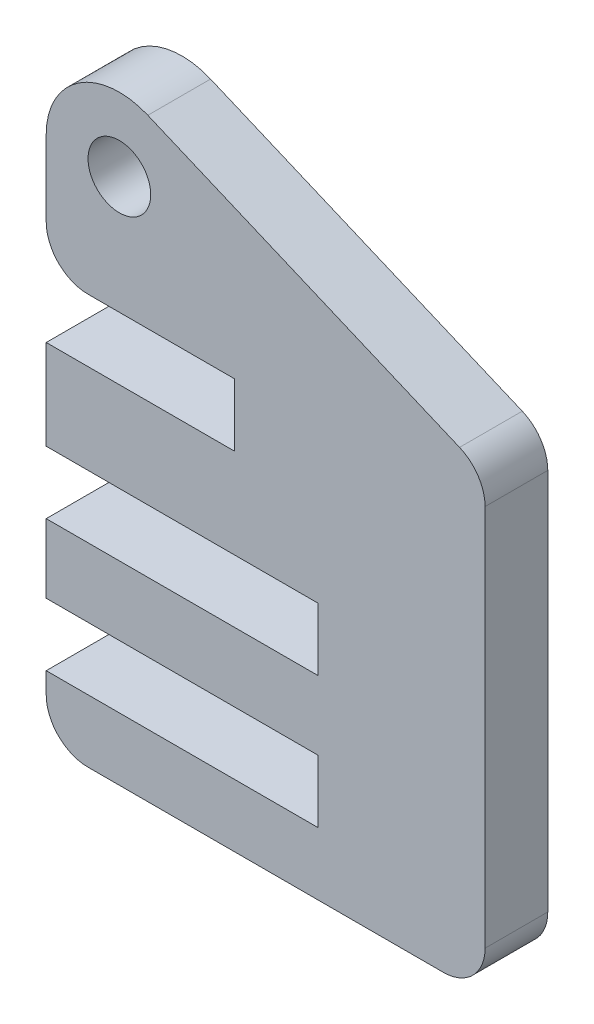
ISO-10303-21;
HEADER;
FILE_DESCRIPTION(('STEP AP214'),'2;1');
FILE_NAME('part.step','',(''),(''),'','','');
FILE_SCHEMA(('AUTOMOTIVE_DESIGN { 1 0 10303 214 1 1 1 1 }'));
ENDSEC;
DATA;
#1=APPLICATION_CONTEXT('core data for automotive mechanical design processes');
#2=APPLICATION_PROTOCOL_DEFINITION('international standard','automotive_design',2000,#1);
#3=PRODUCT_CONTEXT('',#1,'mechanical');
#4=PRODUCT('Part','Part','',(#3));
#5=PRODUCT_RELATED_PRODUCT_CATEGORY('part','',(#4));
#6=PRODUCT_DEFINITION_FORMATION('','',#4);
#7=PRODUCT_DEFINITION_CONTEXT('part definition',#1,'design');
#8=PRODUCT_DEFINITION('design','',#6,#7);
#9=PRODUCT_DEFINITION_SHAPE('','',#8);
#10=(LENGTH_UNIT() NAMED_UNIT(*) SI_UNIT(.MILLI.,.METRE.));
#11=(NAMED_UNIT(*) PLANE_ANGLE_UNIT() SI_UNIT($,.RADIAN.));
#12=(NAMED_UNIT(*) SI_UNIT($,.STERADIAN.) SOLID_ANGLE_UNIT());
#13=UNCERTAINTY_MEASURE_WITH_UNIT(LENGTH_MEASURE(1.E-05),#10,'distance_accuracy_value','');
#14=(GEOMETRIC_REPRESENTATION_CONTEXT(3) GLOBAL_UNCERTAINTY_ASSIGNED_CONTEXT((#13)) GLOBAL_UNIT_ASSIGNED_CONTEXT((#10,
#11,#12)) REPRESENTATION_CONTEXT('',''));
#15=CARTESIAN_POINT('',(0.,0.,0.));
#16=DIRECTION('',(0.,0.,1.));
#17=DIRECTION('',(1.,0.,0.));
#18=AXIS2_PLACEMENT_3D('',#15,#16,#17);
#19=CARTESIAN_POINT('',(-12.7493877892768,-1.50839993540983,3.));
#20=DIRECTION('',(1.,0.,0.));
#21=DIRECTION('',(0.,1.,0.));
#22=AXIS2_PLACEMENT_3D('',#19,#20,#21);
#23=PLANE('',#22);
#24=DIRECTION('',(0.,0.,1.));
#25=VECTOR('',#24,1.);
#26=CARTESIAN_POINT('',(-12.7493877892768,18.0916000645902,0.));
#27=LINE('',#26,#25);
#28=CARTESIAN_POINT('',(-12.7493877892768,18.0916000645902,0.));
#29=VERTEX_POINT('',#28);
#30=CARTESIAN_POINT('',(-12.7493877892768,18.0916000645902,3.));
#31=VERTEX_POINT('',#30);
#32=EDGE_CURVE('E242',#29,#31,#27,.T.);
#33=ORIENTED_EDGE('',*,*,#32,.T.);
#34=DIRECTION('',(0.,-1.,0.));
#35=VECTOR('',#34,1.);
#36=CARTESIAN_POINT('',(-12.7493877892768,-1.50839993540983,3.));
#37=LINE('',#36,#35);
#38=CARTESIAN_POINT('',(-12.7493877892768,21.7138330169719,3.));
#39=VERTEX_POINT('',#38);
#40=EDGE_CURVE('E330',#39,#31,#37,.T.);
#41=ORIENTED_EDGE('',*,*,#40,.F.);
#42=DIRECTION('',(0.,0.,-1.));
#43=VECTOR('',#42,1.);
#44=CARTESIAN_POINT('',(-12.7493877892768,21.7138330169719,3.));
#45=LINE('',#44,#43);
#46=CARTESIAN_POINT('',(-12.7493877892768,21.7138330169719,0.));
#47=VERTEX_POINT('',#46);
#48=EDGE_CURVE('E393',#39,#47,#45,.T.);
#49=ORIENTED_EDGE('',*,*,#48,.T.);
#50=DIRECTION('',(0.,-1.,0.));
#51=VECTOR('',#50,1.);
#52=CARTESIAN_POINT('',(-12.7493877892768,-1.50839993540983,0.));
#53=LINE('',#52,#51);
#54=EDGE_CURVE('E358',#47,#29,#53,.T.);
#55=ORIENTED_EDGE('',*,*,#54,.T.);
#56=EDGE_LOOP('',(#33,#41,#49,#55));
#57=FACE_BOUND('',#56,.T.);
#58=ADVANCED_FACE('F45',(#57),#23,.F.);
#59=CARTESIAN_POINT('',(-12.7493877892768,13.0916000645902,3.));
#60=VERTEX_POINT('',#59);
#61=CARTESIAN_POINT('',(-12.7493877892768,8.79160006459017,3.));
#62=VERTEX_POINT('',#61);
#63=EDGE_CURVE('E335',#60,#62,#37,.T.);
#64=ORIENTED_EDGE('',*,*,#63,.F.);
#65=DIRECTION('',(0.,0.,1.));
#66=VECTOR('',#65,1.);
#67=CARTESIAN_POINT('',(-12.7493877892768,13.0916000645902,0.));
#68=LINE('',#67,#66);
#69=CARTESIAN_POINT('',(-12.7493877892768,13.0916000645902,0.));
#70=VERTEX_POINT('',#69);
#71=EDGE_CURVE('E239',#70,#60,#68,.T.);
#72=ORIENTED_EDGE('',*,*,#71,.F.);
#73=CARTESIAN_POINT('',(-12.7493877892768,8.79160006459017,0.));
#74=VERTEX_POINT('',#73);
#75=EDGE_CURVE('E363',#70,#74,#53,.T.);
#76=ORIENTED_EDGE('',*,*,#75,.T.);
#77=DIRECTION('',(0.,0.,1.));
#78=VECTOR('',#77,1.);
#79=CARTESIAN_POINT('',(-12.7493877892768,8.79160006459017,0.));
#80=LINE('',#79,#78);
#81=EDGE_CURVE('E258',#74,#62,#80,.T.);
#82=ORIENTED_EDGE('',*,*,#81,.T.);
#83=EDGE_LOOP('',(#64,#72,#76,#82));
#84=FACE_BOUND('',#83,.T.);
#85=ADVANCED_FACE('F454',(#84),#23,.F.);
#86=CARTESIAN_POINT('',(-12.7493877892768,5.79160006459017,3.));
#87=VERTEX_POINT('',#86);
#88=CARTESIAN_POINT('',(-12.7493877892768,2.49160006459017,3.));
#89=VERTEX_POINT('',#88);
#90=EDGE_CURVE('E464',#87,#89,#37,.T.);
#91=ORIENTED_EDGE('',*,*,#90,.F.);
#92=DIRECTION('',(0.,0.,1.));
#93=VECTOR('',#92,1.);
#94=CARTESIAN_POINT('',(-12.7493877892768,5.79160006459017,0.));
#95=LINE('',#94,#93);
#96=CARTESIAN_POINT('',(-12.7493877892768,5.79160006459017,0.));
#97=VERTEX_POINT('',#96);
#98=EDGE_CURVE('E248',#97,#87,#95,.T.);
#99=ORIENTED_EDGE('',*,*,#98,.F.);
#100=CARTESIAN_POINT('',(-12.7493877892768,2.49160006459017,0.));
#101=VERTEX_POINT('',#100);
#102=EDGE_CURVE('E443',#97,#101,#53,.T.);
#103=ORIENTED_EDGE('',*,*,#102,.T.);
#104=DIRECTION('',(0.,0.,1.));
#105=VECTOR('',#104,1.);
#106=CARTESIAN_POINT('',(-12.7493877892768,2.49160006459017,0.));
#107=LINE('',#106,#105);
#108=EDGE_CURVE('E292',#101,#89,#107,.T.);
#109=ORIENTED_EDGE('',*,*,#108,.T.);
#110=EDGE_LOOP('',(#91,#99,#103,#109));
#111=FACE_BOUND('',#110,.T.);
#112=ADVANCED_FACE('F480',(#111),#23,.F.);
#113=CARTESIAN_POINT('',(6.2506122107232,16.7916000645902,3.));
#114=DIRECTION('',(0.,0.,-1.));
#115=DIRECTION('',(-1.,0.,0.));
#116=AXIS2_PLACEMENT_3D('',#113,#114,#115);
#117=CYLINDRICAL_SURFACE('',#116,2.);
#118=CARTESIAN_POINT('',(6.2506122107232,16.7916000645902,0.));
#119=DIRECTION('',(0.,0.,1.));
#120=DIRECTION('',(-1.,0.,0.));
#121=AXIS2_PLACEMENT_3D('',#118,#119,#120);
#122=CIRCLE('',#121,2.);
#123=CARTESIAN_POINT('',(8.2506122107232,16.7916000645902,0.));
#124=VERTEX_POINT('',#123);
#125=CARTESIAN_POINT('',(7.02918638776676,18.6338330169719,0.));
#126=VERTEX_POINT('',#125);
#127=EDGE_CURVE('E238',#124,#126,#122,.T.);
#128=ORIENTED_EDGE('',*,*,#127,.T.);
#129=DIRECTION('',(0.,0.,-1.));
#130=VECTOR('',#129,1.);
#131=CARTESIAN_POINT('',(7.02918638776676,18.6338330169719,3.));
#132=LINE('',#131,#130);
#133=CARTESIAN_POINT('',(7.02918638776676,18.6338330169719,3.));
#134=VERTEX_POINT('',#133);
#135=EDGE_CURVE('E11',#134,#126,#132,.T.);
#136=ORIENTED_EDGE('',*,*,#135,.F.);
#137=CARTESIAN_POINT('',(6.2506122107232,16.7916000645902,3.));
#138=DIRECTION('',(0.,0.,1.));
#139=DIRECTION('',(-1.,0.,0.));
#140=AXIS2_PLACEMENT_3D('',#137,#138,#139);
#141=CIRCLE('',#140,2.);
#142=CARTESIAN_POINT('',(8.2506122107232,16.7916000645902,3.));
#143=VERTEX_POINT('',#142);
#144=EDGE_CURVE('E318',#143,#134,#141,.T.);
#145=ORIENTED_EDGE('',*,*,#144,.F.);
#146=DIRECTION('',(0.,0.,-1.));
#147=VECTOR('',#146,1.);
#148=CARTESIAN_POINT('',(8.2506122107232,16.7916000645902,3.));
#149=LINE('',#148,#147);
#150=EDGE_CURVE('E347',#143,#124,#149,.T.);
#151=ORIENTED_EDGE('',*,*,#150,.T.);
#152=EDGE_LOOP('',(#128,#136,#145,#151));
#153=FACE_BOUND('',#152,.T.);
#154=ADVANCED_FACE('F47',(#153),#117,.T.);
#155=CARTESIAN_POINT('',(7.02918638776676,18.6338330169719,3.));
#156=DIRECTION('',(-0.38928708852178,-0.921116476190843,0.));
#157=DIRECTION('',(0.921116476190843,-0.38928708852178,0.));
#158=AXIS2_PLACEMENT_3D('',#155,#156,#157);
#159=PLANE('',#158);
#160=DIRECTION('',(-0.921116476190843,0.38928708852178,0.));
#161=VECTOR('',#160,1.);
#162=CARTESIAN_POINT('',(7.02918638776676,18.6338330169719,0.));
#163=LINE('',#162,#161);
#164=CARTESIAN_POINT('',(-7.88688297945126,24.9377406836394,0.));
#165=VERTEX_POINT('',#164);
#166=EDGE_CURVE('E351',#126,#165,#163,.T.);
#167=ORIENTED_EDGE('',*,*,#166,.T.);
#168=DIRECTION('',(0.,0.,-1.));
#169=VECTOR('',#168,1.);
#170=CARTESIAN_POINT('',(-7.88688297945126,24.9377406836394,3.));
#171=LINE('',#170,#169);
#172=CARTESIAN_POINT('',(-7.88688297945126,24.9377406836394,3.));
#173=VERTEX_POINT('',#172);
#174=EDGE_CURVE('E54',#173,#165,#171,.T.);
#175=ORIENTED_EDGE('',*,*,#174,.F.);
#176=DIRECTION('',(-0.921116476190843,0.38928708852178,0.));
#177=VECTOR('',#176,1.);
#178=CARTESIAN_POINT('',(7.02918638776676,18.6338330169719,3.));
#179=LINE('',#178,#177);
#180=EDGE_CURVE('E322',#134,#173,#179,.T.);
#181=ORIENTED_EDGE('',*,*,#180,.F.);
#182=ORIENTED_EDGE('',*,*,#135,.T.);
#183=EDGE_LOOP('',(#167,#175,#181,#182));
#184=FACE_BOUND('',#183,.T.);
#185=ADVANCED_FACE('F414',(#184),#159,.F.);
#186=CARTESIAN_POINT('',(-9.24938778927729,21.7138330169719,3.));
#187=DIRECTION('',(0.,0.,-1.));
#188=DIRECTION('',(-1.,0.,0.));
#189=AXIS2_PLACEMENT_3D('',#186,#187,#188);
#190=CYLINDRICAL_SURFACE('',#189,3.49999999999951);
#191=CARTESIAN_POINT('',(-9.24938778927729,21.7138330169719,0.));
#192=DIRECTION('',(0.,0.,1.));
#193=DIRECTION('',(-1.,0.,0.));
#194=AXIS2_PLACEMENT_3D('',#191,#192,#193);
#195=CIRCLE('',#194,3.49999999999951);
#196=EDGE_CURVE('E354',#165,#47,#195,.T.);
#197=ORIENTED_EDGE('',*,*,#196,.T.);
#198=ORIENTED_EDGE('',*,*,#48,.F.);
#199=CARTESIAN_POINT('',(-9.24938778927729,21.7138330169719,3.));
#200=DIRECTION('',(0.,0.,1.));
#201=DIRECTION('',(-1.,0.,0.));
#202=AXIS2_PLACEMENT_3D('',#199,#200,#201);
#203=CIRCLE('',#202,3.49999999999951);
#204=EDGE_CURVE('E326',#173,#39,#203,.T.);
#205=ORIENTED_EDGE('',*,*,#204,.F.);
#206=ORIENTED_EDGE('',*,*,#174,.T.);
#207=EDGE_LOOP('',(#197,#198,#205,#206));
#208=FACE_BOUND('',#207,.T.);
#209=ADVANCED_FACE('F402',(#208),#190,.T.);
#210=CARTESIAN_POINT('',(-12.7493877892768,-0.508399935409833,3.));
#211=VERTEX_POINT('',#210);
#212=CARTESIAN_POINT('',(-12.7493877892768,-1.50839993540983,3.));
#213=VERTEX_POINT('',#212);
#214=EDGE_CURVE('E329',#211,#213,#37,.T.);
#215=ORIENTED_EDGE('',*,*,#214,.F.);
#216=DIRECTION('',(0.,0.,1.));
#217=VECTOR('',#216,1.);
#218=CARTESIAN_POINT('',(-12.7493877892768,-0.508399935409833,0.));
#219=LINE('',#218,#217);
#220=CARTESIAN_POINT('',(-12.7493877892768,-0.508399935409833,0.));
#221=VERTEX_POINT('',#220);
#222=EDGE_CURVE('E282',#221,#211,#219,.T.);
#223=ORIENTED_EDGE('',*,*,#222,.F.);
#224=CARTESIAN_POINT('',(-12.7493877892768,-1.50839993540983,0.));
#225=VERTEX_POINT('',#224);
#226=EDGE_CURVE('E357',#221,#225,#53,.T.);
#227=ORIENTED_EDGE('',*,*,#226,.T.);
#228=DIRECTION('',(0.,0.,-1.));
#229=VECTOR('',#228,1.);
#230=CARTESIAN_POINT('',(-12.7493877892768,-1.50839993540983,3.));
#231=LINE('',#230,#229);
#232=EDGE_CURVE('E389',#213,#225,#231,.T.);
#233=ORIENTED_EDGE('',*,*,#232,.F.);
#234=EDGE_LOOP('',(#215,#223,#227,#233));
#235=FACE_BOUND('',#234,.T.);
#236=ADVANCED_FACE('F440',(#235),#23,.F.);
#237=CARTESIAN_POINT('',(-10.7493877892768,-1.50839993540983,3.));
#238=DIRECTION('',(0.,0.,-1.));
#239=DIRECTION('',(-1.,0.,0.));
#240=AXIS2_PLACEMENT_3D('',#237,#238,#239);
#241=CYLINDRICAL_SURFACE('',#240,2.);
#242=CARTESIAN_POINT('',(-10.7493877892768,-1.50839993540983,0.));
#243=DIRECTION('',(0.,0.,1.));
#244=DIRECTION('',(-1.,0.,0.));
#245=AXIS2_PLACEMENT_3D('',#242,#243,#244);
#246=CIRCLE('',#245,2.);
#247=CARTESIAN_POINT('',(-10.7493877892768,-3.50839993540983,0.));
#248=VERTEX_POINT('',#247);
#249=EDGE_CURVE('E362',#225,#248,#246,.T.);
#250=ORIENTED_EDGE('',*,*,#249,.T.);
#251=DIRECTION('',(0.,0.,-1.));
#252=VECTOR('',#251,1.);
#253=CARTESIAN_POINT('',(-10.7493877892768,-3.50839993540983,3.));
#254=LINE('',#253,#252);
#255=CARTESIAN_POINT('',(-10.7493877892768,-3.50839993540983,3.));
#256=VERTEX_POINT('',#255);
#257=EDGE_CURVE('E385',#256,#248,#254,.T.);
#258=ORIENTED_EDGE('',*,*,#257,.F.);
#259=CARTESIAN_POINT('',(-10.7493877892768,-1.50839993540983,3.));
#260=DIRECTION('',(0.,0.,1.));
#261=DIRECTION('',(-1.,0.,0.));
#262=AXIS2_PLACEMENT_3D('',#259,#260,#261);
#263=CIRCLE('',#262,2.);
#264=EDGE_CURVE('E334',#213,#256,#263,.T.);
#265=ORIENTED_EDGE('',*,*,#264,.F.);
#266=ORIENTED_EDGE('',*,*,#232,.T.);
#267=EDGE_LOOP('',(#250,#258,#265,#266));
#268=FACE_BOUND('',#267,.T.);
#269=ADVANCED_FACE('F435',(#268),#241,.T.);
#270=CARTESIAN_POINT('',(6.25061221072319,-3.50839993540984,3.));
#271=DIRECTION('',(0.,1.,0.));
#272=DIRECTION('',(-1.,0.,0.));
#273=AXIS2_PLACEMENT_3D('',#270,#271,#272);
#274=PLANE('',#273);
#275=DIRECTION('',(1.,0.,0.));
#276=VECTOR('',#275,1.);
#277=CARTESIAN_POINT('',(6.25061221072319,-3.50839993540984,0.));
#278=LINE('',#277,#276);
#279=CARTESIAN_POINT('',(6.25061221072319,-3.50839993540984,0.));
#280=VERTEX_POINT('',#279);
#281=EDGE_CURVE('E366',#248,#280,#278,.T.);
#282=ORIENTED_EDGE('',*,*,#281,.T.);
#283=DIRECTION('',(0.,0.,-1.));
#284=VECTOR('',#283,1.);
#285=CARTESIAN_POINT('',(6.25061221072319,-3.50839993540984,3.));
#286=LINE('',#285,#284);
#287=CARTESIAN_POINT('',(6.25061221072319,-3.50839993540984,3.));
#288=VERTEX_POINT('',#287);
#289=EDGE_CURVE('E381',#288,#280,#286,.T.);
#290=ORIENTED_EDGE('',*,*,#289,.F.);
#291=DIRECTION('',(1.,0.,0.));
#292=VECTOR('',#291,1.);
#293=CARTESIAN_POINT('',(6.25061221072319,-3.50839993540984,3.));
#294=LINE('',#293,#292);
#295=EDGE_CURVE('E338',#256,#288,#294,.T.);
#296=ORIENTED_EDGE('',*,*,#295,.F.);
#297=ORIENTED_EDGE('',*,*,#257,.T.);
#298=EDGE_LOOP('',(#282,#290,#296,#297));
#299=FACE_BOUND('',#298,.T.);
#300=ADVANCED_FACE('F430',(#299),#274,.F.);
#301=CARTESIAN_POINT('',(6.25061221072319,-1.50839993540984,3.));
#302=DIRECTION('',(0.,0.,-1.));
#303=DIRECTION('',(-1.,0.,0.));
#304=AXIS2_PLACEMENT_3D('',#301,#302,#303);
#305=CYLINDRICAL_SURFACE('',#304,2.00000000000001);
#306=CARTESIAN_POINT('',(6.25061221072319,-1.50839993540984,0.));
#307=DIRECTION('',(0.,0.,1.));
#308=DIRECTION('',(-1.,0.,0.));
#309=AXIS2_PLACEMENT_3D('',#306,#307,#308);
#310=CIRCLE('',#309,2.00000000000001);
#311=CARTESIAN_POINT('',(8.2506122107232,-1.50839993540984,0.));
#312=VERTEX_POINT('',#311);
#313=EDGE_CURVE('E369',#280,#312,#310,.T.);
#314=ORIENTED_EDGE('',*,*,#313,.T.);
#315=DIRECTION('',(0.,0.,-1.));
#316=VECTOR('',#315,1.);
#317=CARTESIAN_POINT('',(8.2506122107232,-1.50839993540984,3.));
#318=LINE('',#317,#316);
#319=CARTESIAN_POINT('',(8.2506122107232,-1.50839993540984,3.));
#320=VERTEX_POINT('',#319);
#321=EDGE_CURVE('E377',#320,#312,#318,.T.);
#322=ORIENTED_EDGE('',*,*,#321,.F.);
#323=CARTESIAN_POINT('',(6.25061221072319,-1.50839993540984,3.));
#324=DIRECTION('',(0.,0.,1.));
#325=DIRECTION('',(-1.,0.,0.));
#326=AXIS2_PLACEMENT_3D('',#323,#324,#325);
#327=CIRCLE('',#326,2.00000000000001);
#328=EDGE_CURVE('E341',#288,#320,#327,.T.);
#329=ORIENTED_EDGE('',*,*,#328,.F.);
#330=ORIENTED_EDGE('',*,*,#289,.T.);
#331=EDGE_LOOP('',(#314,#322,#329,#330));
#332=FACE_BOUND('',#331,.T.);
#333=ADVANCED_FACE('F426',(#332),#305,.T.);
#334=CARTESIAN_POINT('',(8.2506122107232,16.7916000645902,3.));
#335=DIRECTION('',(-1.,0.,0.));
#336=DIRECTION('',(0.,0.,1.));
#337=AXIS2_PLACEMENT_3D('',#334,#335,#336);
#338=PLANE('',#337);
#339=DIRECTION('',(0.,1.,0.));
#340=VECTOR('',#339,1.);
#341=CARTESIAN_POINT('',(8.2506122107232,16.7916000645902,0.));
#342=LINE('',#341,#340);
#343=EDGE_CURVE('E323',#312,#124,#342,.T.);
#344=ORIENTED_EDGE('',*,*,#343,.T.);
#345=ORIENTED_EDGE('',*,*,#150,.F.);
#346=DIRECTION('',(0.,1.,0.));
#347=VECTOR('',#346,1.);
#348=CARTESIAN_POINT('',(8.2506122107232,16.7916000645902,3.));
#349=LINE('',#348,#347);
#350=EDGE_CURVE('E344',#320,#143,#349,.T.);
#351=ORIENTED_EDGE('',*,*,#350,.F.);
#352=ORIENTED_EDGE('',*,*,#321,.T.);
#353=EDGE_LOOP('',(#344,#345,#351,#352));
#354=FACE_BOUND('',#353,.T.);
#355=ADVANCED_FACE('F421',(#354),#338,.F.);
#356=CARTESIAN_POINT('',(6.2506122107232,16.7916000645902,3.));
#357=DIRECTION('',(0.,0.,-1.));
#358=DIRECTION('',(-1.,0.,0.));
#359=AXIS2_PLACEMENT_3D('',#356,#357,#358);
#360=PLANE('',#359);
#361=CARTESIAN_POINT('',(-9.24938778927729,21.7138330169719,3.));
#362=DIRECTION('',(0.,0.,1.));
#363=DIRECTION('',(1.,0.,0.));
#364=AXIS2_PLACEMENT_3D('',#361,#362,#363);
#365=CIRCLE('',#364,1.5);
#366=CARTESIAN_POINT('',(-7.74938778927729,21.7138330169719,3.));
#367=VERTEX_POINT('',#366);
#368=EDGE_CURVE('E220',#367,#367,#365,.T.);
#369=ORIENTED_EDGE('',*,*,#368,.F.);
#370=EDGE_LOOP('',(#369));
#371=FACE_BOUND('',#370,.T.);
#372=DIRECTION('',(0.,1.,0.));
#373=VECTOR('',#372,1.);
#374=CARTESIAN_POINT('',(-3.74938778927681,16.0916000645902,3.));
#375=LINE('',#374,#373);
#376=CARTESIAN_POINT('',(-3.7493877892768,13.0916000645902,3.));
#377=VERTEX_POINT('',#376);
#378=CARTESIAN_POINT('',(-3.74938778927681,16.0916000645902,3.));
#379=VERTEX_POINT('',#378);
#380=EDGE_CURVE('E196',#377,#379,#375,.T.);
#381=ORIENTED_EDGE('',*,*,#380,.F.);
#382=DIRECTION('',(1.,0.,0.));
#383=VECTOR('',#382,1.);
#384=CARTESIAN_POINT('',(-12.7493877892768,13.0916000645902,3.));
#385=LINE('',#384,#383);
#386=EDGE_CURVE('E213',#60,#377,#385,.T.);
#387=ORIENTED_EDGE('',*,*,#386,.F.);
#388=ORIENTED_EDGE('',*,*,#63,.T.);
#389=DIRECTION('',(-1.,0.,0.));
#390=VECTOR('',#389,1.);
#391=CARTESIAN_POINT('',(-12.7493877892768,8.79160006459017,3.));
#392=LINE('',#391,#390);
#393=CARTESIAN_POINT('',(0.250612210723197,8.79160006459017,3.));
#394=VERTEX_POINT('',#393);
#395=EDGE_CURVE('E263',#394,#62,#392,.T.);
#396=ORIENTED_EDGE('',*,*,#395,.F.);
#397=DIRECTION('',(0.,1.,0.));
#398=VECTOR('',#397,1.);
#399=CARTESIAN_POINT('',(0.250612210723197,8.79160006459017,3.));
#400=LINE('',#399,#398);
#401=CARTESIAN_POINT('',(0.250612210723197,5.79160006459017,3.));
#402=VERTEX_POINT('',#401);
#403=EDGE_CURVE('E266',#402,#394,#400,.T.);
#404=ORIENTED_EDGE('',*,*,#403,.F.);
#405=DIRECTION('',(1.,0.,0.));
#406=VECTOR('',#405,1.);
#407=CARTESIAN_POINT('',(-12.7493877892768,5.79160006459017,3.));
#408=LINE('',#407,#406);
#409=EDGE_CURVE('E230',#87,#402,#408,.T.);
#410=ORIENTED_EDGE('',*,*,#409,.F.);
#411=ORIENTED_EDGE('',*,*,#90,.T.);
#412=DIRECTION('',(-1.,0.,0.));
#413=VECTOR('',#412,1.);
#414=CARTESIAN_POINT('',(-12.7493877892768,2.49160006459017,3.));
#415=LINE('',#414,#413);
#416=CARTESIAN_POINT('',(0.250612210723197,2.49160006459017,3.));
#417=VERTEX_POINT('',#416);
#418=EDGE_CURVE('E297',#417,#89,#415,.T.);
#419=ORIENTED_EDGE('',*,*,#418,.F.);
#420=DIRECTION('',(0.,1.,0.));
#421=VECTOR('',#420,1.);
#422=CARTESIAN_POINT('',(0.250612210723197,2.49160006459017,3.));
#423=LINE('',#422,#421);
#424=CARTESIAN_POINT('',(0.250612210723197,-0.508399935409831,3.));
#425=VERTEX_POINT('',#424);
#426=EDGE_CURVE('E300',#425,#417,#423,.T.);
#427=ORIENTED_EDGE('',*,*,#426,.F.);
#428=DIRECTION('',(1.,0.,0.));
#429=VECTOR('',#428,1.);
#430=CARTESIAN_POINT('',(-12.7493877892768,-0.508399935409833,3.));
#431=LINE('',#430,#429);
#432=EDGE_CURVE('E262',#211,#425,#431,.T.);
#433=ORIENTED_EDGE('',*,*,#432,.F.);
#434=ORIENTED_EDGE('',*,*,#214,.T.);
#435=ORIENTED_EDGE('',*,*,#264,.T.);
#436=ORIENTED_EDGE('',*,*,#295,.T.);
#437=ORIENTED_EDGE('',*,*,#328,.T.);
#438=ORIENTED_EDGE('',*,*,#350,.T.);
#439=ORIENTED_EDGE('',*,*,#144,.T.);
#440=ORIENTED_EDGE('',*,*,#180,.T.);
#441=ORIENTED_EDGE('',*,*,#204,.T.);
#442=ORIENTED_EDGE('',*,*,#40,.T.);
#443=CARTESIAN_POINT('',(-10.7493877892768,18.0916000645902,3.));
#444=DIRECTION('',(0.,0.,-1.));
#445=DIRECTION('',(-1.,0.,0.));
#446=AXIS2_PLACEMENT_3D('',#443,#444,#445);
#447=CIRCLE('',#446,2.);
#448=CARTESIAN_POINT('',(-10.7493877892768,16.0916000645902,3.));
#449=VERTEX_POINT('',#448);
#450=EDGE_CURVE('E217',#449,#31,#447,.T.);
#451=ORIENTED_EDGE('',*,*,#450,.F.);
#452=DIRECTION('',(-1.,0.,0.));
#453=VECTOR('',#452,1.);
#454=CARTESIAN_POINT('',(-3.74938778927681,16.0916000645902,3.));
#455=LINE('',#454,#453);
#456=EDGE_CURVE('E229',#379,#449,#455,.T.);
#457=ORIENTED_EDGE('',*,*,#456,.F.);
#458=EDGE_LOOP('',(#381,#387,#388,#396,#404,#410,#411,#419,#427,#433,#434,#435,#436,#437,#438,
#439,#440,#441,#442,#451,#457));
#459=FACE_BOUND('',#458,.T.);
#460=ADVANCED_FACE('F411',(#371,#459),#360,.F.);
#461=CARTESIAN_POINT('',(6.2506122107232,16.7916000645902,0.));
#462=DIRECTION('',(0.,0.,-1.));
#463=DIRECTION('',(-1.,0.,0.));
#464=AXIS2_PLACEMENT_3D('',#461,#462,#463);
#465=PLANE('',#464);
#466=CARTESIAN_POINT('',(-9.24938778927729,21.7138330169719,0.));
#467=DIRECTION('',(0.,0.,1.));
#468=DIRECTION('',(1.,0.,0.));
#469=AXIS2_PLACEMENT_3D('',#466,#467,#468);
#470=CIRCLE('',#469,1.5);
#471=CARTESIAN_POINT('',(-7.74938778927729,21.7138330169719,0.));
#472=VERTEX_POINT('',#471);
#473=EDGE_CURVE('E296',#472,#472,#470,.T.);
#474=ORIENTED_EDGE('',*,*,#473,.T.);
#475=EDGE_LOOP('',(#474));
#476=FACE_BOUND('',#475,.T.);
#477=DIRECTION('',(1.,0.,0.));
#478=VECTOR('',#477,1.);
#479=CARTESIAN_POINT('',(-12.7493877892768,13.0916000645902,0.));
#480=LINE('',#479,#478);
#481=CARTESIAN_POINT('',(-3.7493877892768,13.0916000645902,0.));
#482=VERTEX_POINT('',#481);
#483=EDGE_CURVE('E202',#70,#482,#480,.T.);
#484=ORIENTED_EDGE('',*,*,#483,.T.);
#485=DIRECTION('',(0.,1.,0.));
#486=VECTOR('',#485,1.);
#487=CARTESIAN_POINT('',(-3.74938778927681,16.0916000645902,0.));
#488=LINE('',#487,#486);
#489=CARTESIAN_POINT('',(-3.74938778927681,16.0916000645902,0.));
#490=VERTEX_POINT('',#489);
#491=EDGE_CURVE('E193',#482,#490,#488,.T.);
#492=ORIENTED_EDGE('',*,*,#491,.T.);
#493=DIRECTION('',(-1.,0.,0.));
#494=VECTOR('',#493,1.);
#495=CARTESIAN_POINT('',(-3.74938778927681,16.0916000645902,0.));
#496=LINE('',#495,#494);
#497=CARTESIAN_POINT('',(-10.7493877892768,16.0916000645902,0.));
#498=VERTEX_POINT('',#497);
#499=EDGE_CURVE('E205',#490,#498,#496,.T.);
#500=ORIENTED_EDGE('',*,*,#499,.T.);
#501=CARTESIAN_POINT('',(-10.7493877892768,18.0916000645902,0.));
#502=DIRECTION('',(0.,0.,-1.));
#503=DIRECTION('',(-1.,0.,0.));
#504=AXIS2_PLACEMENT_3D('',#501,#502,#503);
#505=CIRCLE('',#504,2.);
#506=EDGE_CURVE('E61',#498,#29,#505,.T.);
#507=ORIENTED_EDGE('',*,*,#506,.T.);
#508=ORIENTED_EDGE('',*,*,#54,.F.);
#509=ORIENTED_EDGE('',*,*,#196,.F.);
#510=ORIENTED_EDGE('',*,*,#166,.F.);
#511=ORIENTED_EDGE('',*,*,#127,.F.);
#512=ORIENTED_EDGE('',*,*,#343,.F.);
#513=ORIENTED_EDGE('',*,*,#313,.F.);
#514=ORIENTED_EDGE('',*,*,#281,.F.);
#515=ORIENTED_EDGE('',*,*,#249,.F.);
#516=ORIENTED_EDGE('',*,*,#226,.F.);
#517=DIRECTION('',(1.,0.,0.));
#518=VECTOR('',#517,1.);
#519=CARTESIAN_POINT('',(-12.7493877892768,-0.508399935409833,0.));
#520=LINE('',#519,#518);
#521=CARTESIAN_POINT('',(0.250612210723197,-0.50839993540983,0.));
#522=VERTEX_POINT('',#521);
#523=EDGE_CURVE('E301',#221,#522,#520,.T.);
#524=ORIENTED_EDGE('',*,*,#523,.T.);
#525=DIRECTION('',(0.,1.,0.));
#526=VECTOR('',#525,1.);
#527=CARTESIAN_POINT('',(0.250612210723197,2.49160006459017,0.));
#528=LINE('',#527,#526);
#529=CARTESIAN_POINT('',(0.250612210723197,2.49160006459017,0.));
#530=VERTEX_POINT('',#529);
#531=EDGE_CURVE('E311',#522,#530,#528,.T.);
#532=ORIENTED_EDGE('',*,*,#531,.T.);
#533=DIRECTION('',(-1.,0.,0.));
#534=VECTOR('',#533,1.);
#535=CARTESIAN_POINT('',(-12.7493877892768,2.49160006459017,0.));
#536=LINE('',#535,#534);
#537=EDGE_CURVE('E285',#530,#101,#536,.T.);
#538=ORIENTED_EDGE('',*,*,#537,.T.);
#539=ORIENTED_EDGE('',*,*,#102,.F.);
#540=DIRECTION('',(1.,0.,0.));
#541=VECTOR('',#540,1.);
#542=CARTESIAN_POINT('',(-12.7493877892768,5.79160006459017,0.));
#543=LINE('',#542,#541);
#544=CARTESIAN_POINT('',(0.250612210723197,5.79160006459017,0.));
#545=VERTEX_POINT('',#544);
#546=EDGE_CURVE('E267',#97,#545,#543,.T.);
#547=ORIENTED_EDGE('',*,*,#546,.T.);
#548=DIRECTION('',(0.,1.,0.));
#549=VECTOR('',#548,1.);
#550=CARTESIAN_POINT('',(0.250612210723197,8.79160006459017,0.));
#551=LINE('',#550,#549);
#552=CARTESIAN_POINT('',(0.250612210723197,8.79160006459017,0.));
#553=VERTEX_POINT('',#552);
#554=EDGE_CURVE('E69',#545,#553,#551,.T.);
#555=ORIENTED_EDGE('',*,*,#554,.T.);
#556=DIRECTION('',(-1.,0.,0.));
#557=VECTOR('',#556,1.);
#558=CARTESIAN_POINT('',(-12.7493877892768,8.79160006459017,0.));
#559=LINE('',#558,#557);
#560=EDGE_CURVE('E251',#553,#74,#559,.T.);
#561=ORIENTED_EDGE('',*,*,#560,.T.);
#562=ORIENTED_EDGE('',*,*,#75,.F.);
#563=EDGE_LOOP('',(#484,#492,#500,#507,#508,#509,#510,#511,#512,#513,#514,#515,#516,#524,#532,
#538,#539,#547,#555,#561,#562));
#564=FACE_BOUND('',#563,.T.);
#565=ADVANCED_FACE('F210',(#476,#564),#465,.T.);
#566=CARTESIAN_POINT('',(-12.7493877892768,2.49160006459017,0.));
#567=DIRECTION('',(0.,1.,0.));
#568=DIRECTION('',(-1.,0.,0.));
#569=AXIS2_PLACEMENT_3D('',#566,#567,#568);
#570=PLANE('',#569);
#571=ORIENTED_EDGE('',*,*,#418,.T.);
#572=ORIENTED_EDGE('',*,*,#108,.F.);
#573=ORIENTED_EDGE('',*,*,#537,.F.);
#574=DIRECTION('',(0.,0.,1.));
#575=VECTOR('',#574,1.);
#576=CARTESIAN_POINT('',(0.250612210723197,2.49160006459017,0.));
#577=LINE('',#576,#575);
#578=EDGE_CURVE('E289',#530,#417,#577,.T.);
#579=ORIENTED_EDGE('',*,*,#578,.T.);
#580=EDGE_LOOP('',(#571,#572,#573,#579));
#581=FACE_BOUND('',#580,.T.);
#582=ADVANCED_FACE('F479',(#581),#570,.F.);
#583=CARTESIAN_POINT('',(0.250612210723197,2.49160006459017,0.));
#584=DIRECTION('',(1.,0.,0.));
#585=DIRECTION('',(0.,1.,0.));
#586=AXIS2_PLACEMENT_3D('',#583,#584,#585);
#587=PLANE('',#586);
#588=ORIENTED_EDGE('',*,*,#426,.T.);
#589=ORIENTED_EDGE('',*,*,#578,.F.);
#590=ORIENTED_EDGE('',*,*,#531,.F.);
#591=DIRECTION('',(0.,0.,1.));
#592=VECTOR('',#591,1.);
#593=CARTESIAN_POINT('',(0.250612210723197,-0.508399935409831,0.));
#594=LINE('',#593,#592);
#595=EDGE_CURVE('E286',#522,#425,#594,.T.);
#596=ORIENTED_EDGE('',*,*,#595,.T.);
#597=EDGE_LOOP('',(#588,#589,#590,#596));
#598=FACE_BOUND('',#597,.T.);
#599=ADVANCED_FACE('F477',(#598),#587,.F.);
#600=CARTESIAN_POINT('',(-12.7493877892768,-0.508399935409833,0.));
#601=DIRECTION('',(0.,-1.,0.));
#602=DIRECTION('',(1.,0.,0.));
#603=AXIS2_PLACEMENT_3D('',#600,#601,#602);
#604=PLANE('',#603);
#605=ORIENTED_EDGE('',*,*,#432,.T.);
#606=ORIENTED_EDGE('',*,*,#595,.F.);
#607=ORIENTED_EDGE('',*,*,#523,.F.);
#608=ORIENTED_EDGE('',*,*,#222,.T.);
#609=EDGE_LOOP('',(#605,#606,#607,#608));
#610=FACE_BOUND('',#609,.T.);
#611=ADVANCED_FACE('F474',(#610),#604,.F.);
#612=CARTESIAN_POINT('',(-12.7493877892768,8.79160006459017,0.));
#613=DIRECTION('',(0.,1.,0.));
#614=DIRECTION('',(-1.,0.,0.));
#615=AXIS2_PLACEMENT_3D('',#612,#613,#614);
#616=PLANE('',#615);
#617=ORIENTED_EDGE('',*,*,#395,.T.);
#618=ORIENTED_EDGE('',*,*,#81,.F.);
#619=ORIENTED_EDGE('',*,*,#560,.F.);
#620=DIRECTION('',(0.,0.,1.));
#621=VECTOR('',#620,1.);
#622=CARTESIAN_POINT('',(0.250612210723197,8.79160006459017,0.));
#623=LINE('',#622,#621);
#624=EDGE_CURVE('E255',#553,#394,#623,.T.);
#625=ORIENTED_EDGE('',*,*,#624,.T.);
#626=EDGE_LOOP('',(#617,#618,#619,#625));
#627=FACE_BOUND('',#626,.T.);
#628=ADVANCED_FACE('F458',(#627),#616,.F.);
#629=CARTESIAN_POINT('',(0.250612210723197,8.79160006459017,0.));
#630=DIRECTION('',(1.,0.,0.));
#631=DIRECTION('',(0.,1.,0.));
#632=AXIS2_PLACEMENT_3D('',#629,#630,#631);
#633=PLANE('',#632);
#634=ORIENTED_EDGE('',*,*,#403,.T.);
#635=ORIENTED_EDGE('',*,*,#624,.F.);
#636=ORIENTED_EDGE('',*,*,#554,.F.);
#637=DIRECTION('',(0.,0.,1.));
#638=VECTOR('',#637,1.);
#639=CARTESIAN_POINT('',(0.250612210723197,5.79160006459017,0.));
#640=LINE('',#639,#638);
#641=EDGE_CURVE('E252',#545,#402,#640,.T.);
#642=ORIENTED_EDGE('',*,*,#641,.T.);
#643=EDGE_LOOP('',(#634,#635,#636,#642));
#644=FACE_BOUND('',#643,.T.);
#645=ADVANCED_FACE('F483',(#644),#633,.F.);
#646=CARTESIAN_POINT('',(-12.7493877892768,5.79160006459017,0.));
#647=DIRECTION('',(0.,-1.,0.));
#648=DIRECTION('',(1.,0.,0.));
#649=AXIS2_PLACEMENT_3D('',#646,#647,#648);
#650=PLANE('',#649);
#651=ORIENTED_EDGE('',*,*,#409,.T.);
#652=ORIENTED_EDGE('',*,*,#641,.F.);
#653=ORIENTED_EDGE('',*,*,#546,.F.);
#654=ORIENTED_EDGE('',*,*,#98,.T.);
#655=EDGE_LOOP('',(#651,#652,#653,#654));
#656=FACE_BOUND('',#655,.T.);
#657=ADVANCED_FACE('F482',(#656),#650,.F.);
#658=CARTESIAN_POINT('',(-3.74938778927681,16.0916000645902,0.));
#659=DIRECTION('',(1.,0.,0.));
#660=DIRECTION('',(0.,1.,0.));
#661=AXIS2_PLACEMENT_3D('',#658,#659,#660);
#662=PLANE('',#661);
#663=ORIENTED_EDGE('',*,*,#380,.T.);
#664=DIRECTION('',(0.,0.,1.));
#665=VECTOR('',#664,1.);
#666=CARTESIAN_POINT('',(-3.74938778927681,16.0916000645902,0.));
#667=LINE('',#666,#665);
#668=EDGE_CURVE('E189',#490,#379,#667,.T.);
#669=ORIENTED_EDGE('',*,*,#668,.F.);
#670=ORIENTED_EDGE('',*,*,#491,.F.);
#671=DIRECTION('',(0.,0.,1.));
#672=VECTOR('',#671,1.);
#673=CARTESIAN_POINT('',(-3.7493877892768,13.0916000645902,0.));
#674=LINE('',#673,#672);
#675=EDGE_CURVE('E235',#482,#377,#674,.T.);
#676=ORIENTED_EDGE('',*,*,#675,.T.);
#677=EDGE_LOOP('',(#663,#669,#670,#676));
#678=FACE_BOUND('',#677,.T.);
#679=ADVANCED_FACE('F191',(#678),#662,.F.);
#680=CARTESIAN_POINT('',(-12.7493877892768,13.0916000645902,0.));
#681=DIRECTION('',(0.,-1.,0.));
#682=DIRECTION('',(1.,0.,0.));
#683=AXIS2_PLACEMENT_3D('',#680,#681,#682);
#684=PLANE('',#683);
#685=ORIENTED_EDGE('',*,*,#386,.T.);
#686=ORIENTED_EDGE('',*,*,#675,.F.);
#687=ORIENTED_EDGE('',*,*,#483,.F.);
#688=ORIENTED_EDGE('',*,*,#71,.T.);
#689=EDGE_LOOP('',(#685,#686,#687,#688));
#690=FACE_BOUND('',#689,.T.);
#691=ADVANCED_FACE('F628',(#690),#684,.F.);
#692=CARTESIAN_POINT('',(-10.7493877892768,18.0916000645902,0.));
#693=DIRECTION('',(0.,0.,1.));
#694=DIRECTION('',(1.,0.,0.));
#695=AXIS2_PLACEMENT_3D('',#692,#693,#694);
#696=CYLINDRICAL_SURFACE('',#695,2.);
#697=ORIENTED_EDGE('',*,*,#450,.T.);
#698=ORIENTED_EDGE('',*,*,#32,.F.);
#699=ORIENTED_EDGE('',*,*,#506,.F.);
#700=DIRECTION('',(0.,0.,1.));
#701=VECTOR('',#700,1.);
#702=CARTESIAN_POINT('',(-10.7493877892768,16.0916000645902,0.));
#703=LINE('',#702,#701);
#704=EDGE_CURVE('E201',#498,#449,#703,.T.);
#705=ORIENTED_EDGE('',*,*,#704,.T.);
#706=EDGE_LOOP('',(#697,#698,#699,#705));
#707=FACE_BOUND('',#706,.T.);
#708=ADVANCED_FACE('F637',(#707),#696,.T.);
#709=CARTESIAN_POINT('',(-3.74938778927681,16.0916000645902,0.));
#710=DIRECTION('',(0.,1.,0.));
#711=DIRECTION('',(-1.,0.,0.));
#712=AXIS2_PLACEMENT_3D('',#709,#710,#711);
#713=PLANE('',#712);
#714=ORIENTED_EDGE('',*,*,#456,.T.);
#715=ORIENTED_EDGE('',*,*,#704,.F.);
#716=ORIENTED_EDGE('',*,*,#499,.F.);
#717=ORIENTED_EDGE('',*,*,#668,.T.);
#718=EDGE_LOOP('',(#714,#715,#716,#717));
#719=FACE_BOUND('',#718,.T.);
#720=ADVANCED_FACE('F206',(#719),#713,.F.);
#721=CARTESIAN_POINT('',(-9.24938778927729,21.7138330169719,0.));
#722=DIRECTION('',(0.,0.,1.));
#723=DIRECTION('',(1.,0.,0.));
#724=AXIS2_PLACEMENT_3D('',#721,#722,#723);
#725=CYLINDRICAL_SURFACE('',#724,1.5);
#726=ORIENTED_EDGE('',*,*,#473,.F.);
#727=EDGE_LOOP('',(#726));
#728=FACE_BOUND('',#727,.T.);
#729=ORIENTED_EDGE('',*,*,#368,.T.);
#730=EDGE_LOOP('',(#729));
#731=FACE_BOUND('',#730,.T.);
#732=ADVANCED_FACE('F654',(#728,#731),#725,.F.);
#733=CLOSED_SHELL('',(#58,#85,#112,#154,#185,#209,#236,#269,#300,#333,#355,#460,#565,#582,#599,
#611,#628,#645,#657,#679,#691,#708,#720,#732));
#734=MANIFOLD_SOLID_BREP('B2',#733);
#735=ADVANCED_BREP_SHAPE_REPRESENTATION('',(#18,#734),#14);
#736=SHAPE_DEFINITION_REPRESENTATION(#9,#735);
ENDSEC;
END-ISO-10303-21;
